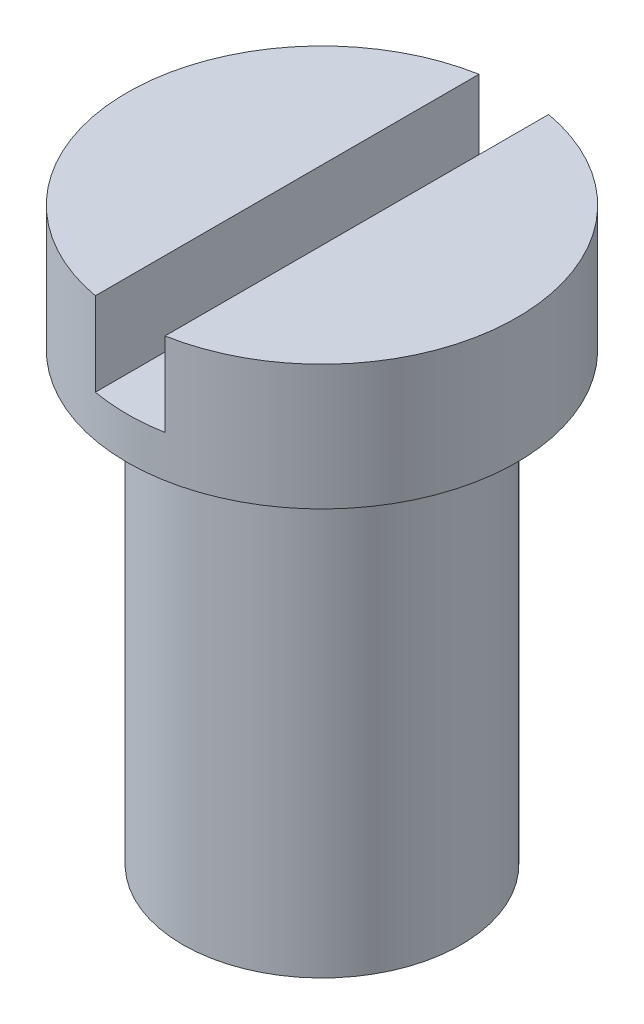
ISO-10303-21;
HEADER;
FILE_DESCRIPTION(('STEP AP214'),'2;1');
FILE_NAME('part.step','',(''),(''),'','','');
FILE_SCHEMA(('AUTOMOTIVE_DESIGN { 1 0 10303 214 1 1 1 1 }'));
ENDSEC;
DATA;
#1=APPLICATION_CONTEXT('core data for automotive mechanical design processes');
#2=APPLICATION_PROTOCOL_DEFINITION('international standard','automotive_design',2000,#1);
#3=PRODUCT_CONTEXT('',#1,'mechanical');
#4=PRODUCT('Part','Part','',(#3));
#5=PRODUCT_RELATED_PRODUCT_CATEGORY('part','',(#4));
#6=PRODUCT_DEFINITION_FORMATION('','',#4);
#7=PRODUCT_DEFINITION_CONTEXT('part definition',#1,'design');
#8=PRODUCT_DEFINITION('design','',#6,#7);
#9=PRODUCT_DEFINITION_SHAPE('','',#8);
#10=(LENGTH_UNIT() NAMED_UNIT(*) SI_UNIT(.MILLI.,.METRE.));
#11=(NAMED_UNIT(*) PLANE_ANGLE_UNIT() SI_UNIT($,.RADIAN.));
#12=(NAMED_UNIT(*) SI_UNIT($,.STERADIAN.) SOLID_ANGLE_UNIT());
#13=UNCERTAINTY_MEASURE_WITH_UNIT(LENGTH_MEASURE(1.E-05),#10,'distance_accuracy_value','');
#14=(GEOMETRIC_REPRESENTATION_CONTEXT(3) GLOBAL_UNCERTAINTY_ASSIGNED_CONTEXT((#13)) GLOBAL_UNIT_ASSIGNED_CONTEXT((#10,
#11,#12)) REPRESENTATION_CONTEXT('',''));
#15=CARTESIAN_POINT('',(0.,0.,0.));
#16=DIRECTION('',(0.,0.,1.));
#17=DIRECTION('',(1.,0.,0.));
#18=AXIS2_PLACEMENT_3D('',#15,#16,#17);
#19=CARTESIAN_POINT('',(15.546654773577,33.021554202414,1.140130435942));
#20=DIRECTION('',(0.,-1.,0.));
#21=DIRECTION('',(0.,0.,-1.));
#22=AXIS2_PLACEMENT_3D('',#19,#20,#21);
#23=PLANE('',#22);
#24=DIRECTION('',(0.,0.,1.));
#25=VECTOR('',#24,1.);
#26=CARTESIAN_POINT('',(15.546654773577,33.021554202414,1.140130435942));
#27=LINE('',#26,#25);
#28=CARTESIAN_POINT('',(15.546654773577,33.021554202414,-1.9173696954538));
#29=VERTEX_POINT('',#28);
#30=CARTESIAN_POINT('',(15.546654773577,33.021554202414,0.837625767337296));
#31=VERTEX_POINT('',#30);
#32=EDGE_CURVE('E72',#29,#31,#27,.T.);
#33=ORIENTED_EDGE('',*,*,#32,.T.);
#34=CARTESIAN_POINT('',(15.796654773577,33.021554202414,-0.539871964058));
#35=DIRECTION('',(0.,-1.,0.));
#36=DIRECTION('',(0.,0.,-1.));
#37=AXIS2_PLACEMENT_3D('',#34,#35,#36);
#38=CIRCLE('',#37,1.4);
#39=CARTESIAN_POINT('',(16.046654773577,33.021554202414,0.837625767337296));
#40=VERTEX_POINT('',#39);
#41=EDGE_CURVE('E20',#40,#31,#38,.T.);
#42=ORIENTED_EDGE('',*,*,#41,.F.);
#43=DIRECTION('',(0.,0.,-1.));
#44=VECTOR('',#43,1.);
#45=CARTESIAN_POINT('',(16.046654773577,33.021554202414,1.140130435942));
#46=LINE('',#45,#44);
#47=CARTESIAN_POINT('',(16.046654773577,33.021554202414,-1.9173696954538));
#48=VERTEX_POINT('',#47);
#49=EDGE_CURVE('E64',#40,#48,#46,.T.);
#50=ORIENTED_EDGE('',*,*,#49,.T.);
#51=CARTESIAN_POINT('',(15.796654773577,33.021554202414,-0.539871964058));
#52=DIRECTION('',(0.,-1.,0.));
#53=DIRECTION('',(0.,0.,-1.));
#54=AXIS2_PLACEMENT_3D('',#51,#52,#53);
#55=CIRCLE('',#54,1.4);
#56=EDGE_CURVE('E65',#29,#48,#55,.T.);
#57=ORIENTED_EDGE('',*,*,#56,.F.);
#58=EDGE_LOOP('',(#33,#42,#50,#57));
#59=FACE_BOUND('',#58,.T.);
#60=ADVANCED_FACE('F17',(#59),#23,.F.);
#61=CARTESIAN_POINT('',(16.046654773577,33.021554202414,1.140130435942));
#62=DIRECTION('',(1.,0.,0.));
#63=DIRECTION('',(0.,0.,-1.));
#64=AXIS2_PLACEMENT_3D('',#61,#62,#63);
#65=PLANE('',#64);
#66=ORIENTED_EDGE('',*,*,#49,.F.);
#67=DIRECTION('',(0.,1.,0.));
#68=VECTOR('',#67,1.);
#69=CARTESIAN_POINT('',(16.046654773577,33.021554202414,0.837625767337));
#70=LINE('',#69,#68);
#71=CARTESIAN_POINT('',(16.046654773577,33.621554202414,0.837625767337296));
#72=VERTEX_POINT('',#71);
#73=EDGE_CURVE('E53',#72,#40,#70,.F.);
#74=ORIENTED_EDGE('',*,*,#73,.F.);
#75=DIRECTION('',(0.,0.,-1.));
#76=VECTOR('',#75,1.);
#77=CARTESIAN_POINT('',(16.046654773577,33.621554202414,-0.539871964058));
#78=LINE('',#77,#76);
#79=CARTESIAN_POINT('',(16.046654773577,33.621554202414,-1.9173696954538));
#80=VERTEX_POINT('',#79);
#81=EDGE_CURVE('E92',#72,#80,#78,.T.);
#82=ORIENTED_EDGE('',*,*,#81,.T.);
#83=DIRECTION('',(0.,1.,0.));
#84=VECTOR('',#83,1.);
#85=CARTESIAN_POINT('',(16.046654773577,33.021554202414,-1.917369695454));
#86=LINE('',#85,#84);
#87=EDGE_CURVE('E74',#48,#80,#86,.T.);
#88=ORIENTED_EDGE('',*,*,#87,.F.);
#89=EDGE_LOOP('',(#66,#74,#82,#88));
#90=FACE_BOUND('',#89,.T.);
#91=ADVANCED_FACE('F73',(#90),#65,.F.);
#92=CARTESIAN_POINT('',(15.546654773577,33.621554202414,1.140130435942));
#93=DIRECTION('',(-1.,0.,0.));
#94=DIRECTION('',(0.,0.,1.));
#95=AXIS2_PLACEMENT_3D('',#92,#93,#94);
#96=PLANE('',#95);
#97=ORIENTED_EDGE('',*,*,#32,.F.);
#98=DIRECTION('',(0.,1.,0.));
#99=VECTOR('',#98,1.);
#100=CARTESIAN_POINT('',(15.546654773577,33.621554202414,-1.917369695454));
#101=LINE('',#100,#99);
#102=CARTESIAN_POINT('',(15.546654773577,33.621554202414,-1.9173696954538));
#103=VERTEX_POINT('',#102);
#104=EDGE_CURVE('E76',#103,#29,#101,.F.);
#105=ORIENTED_EDGE('',*,*,#104,.F.);
#106=DIRECTION('',(0.,0.,-1.));
#107=VECTOR('',#106,1.);
#108=CARTESIAN_POINT('',(15.546654773577,33.621554202414,-0.539871964058));
#109=LINE('',#108,#107);
#110=CARTESIAN_POINT('',(15.546654773577,33.621554202414,0.837625767337296));
#111=VERTEX_POINT('',#110);
#112=EDGE_CURVE('E87',#103,#111,#109,.F.);
#113=ORIENTED_EDGE('',*,*,#112,.T.);
#114=DIRECTION('',(0.,1.,0.));
#115=VECTOR('',#114,1.);
#116=CARTESIAN_POINT('',(15.546654773577,33.621554202414,0.837625767337));
#117=LINE('',#116,#115);
#118=EDGE_CURVE('E35',#31,#111,#117,.T.);
#119=ORIENTED_EDGE('',*,*,#118,.F.);
#120=EDGE_LOOP('',(#97,#105,#113,#119));
#121=FACE_BOUND('',#120,.T.);
#122=ADVANCED_FACE('F90',(#121),#96,.F.);
#123=CARTESIAN_POINT('',(15.196654773577,33.621554202414,-0.539871964058));
#124=DIRECTION('',(0.,-1.,0.));
#125=DIRECTION('',(0.,0.,-1.));
#126=AXIS2_PLACEMENT_3D('',#123,#124,#125);
#127=PLANE('',#126);
#128=CARTESIAN_POINT('',(15.796654773577,33.621554202414,-0.539871964058));
#129=DIRECTION('',(0.,-1.,0.));
#130=DIRECTION('',(0.,0.,-1.));
#131=AXIS2_PLACEMENT_3D('',#128,#129,#130);
#132=CIRCLE('',#131,1.4);
#133=EDGE_CURVE('E59',#80,#72,#132,.T.);
#134=ORIENTED_EDGE('',*,*,#133,.F.);
#135=ORIENTED_EDGE('',*,*,#81,.F.);
#136=EDGE_LOOP('',(#134,#135));
#137=FACE_BOUND('',#136,.T.);
#138=ADVANCED_FACE('F101',(#137),#127,.F.);
#139=CARTESIAN_POINT('',(15.196654773577,33.621554202414,-0.539871964058));
#140=DIRECTION('',(0.,-1.,0.));
#141=DIRECTION('',(0.,0.,-1.));
#142=AXIS2_PLACEMENT_3D('',#139,#140,#141);
#143=PLANE('',#142);
#144=CARTESIAN_POINT('',(15.796654773577,33.621554202414,-0.539871964058));
#145=DIRECTION('',(0.,-1.,0.));
#146=DIRECTION('',(0.,0.,-1.));
#147=AXIS2_PLACEMENT_3D('',#144,#145,#146);
#148=CIRCLE('',#147,1.4);
#149=EDGE_CURVE('E85',#111,#103,#148,.T.);
#150=ORIENTED_EDGE('',*,*,#149,.F.);
#151=ORIENTED_EDGE('',*,*,#112,.F.);
#152=EDGE_LOOP('',(#150,#151));
#153=FACE_BOUND('',#152,.T.);
#154=ADVANCED_FACE('F99',(#153),#143,.F.);
#155=CARTESIAN_POINT('',(15.796654773577,33.171554202414,-0.539871964058));
#156=DIRECTION('',(0.,-1.,0.));
#157=DIRECTION('',(0.,0.,-1.));
#158=AXIS2_PLACEMENT_3D('',#155,#156,#157);
#159=CYLINDRICAL_SURFACE('',#158,1.4);
#160=ORIENTED_EDGE('',*,*,#87,.T.);
#161=ORIENTED_EDGE('',*,*,#133,.T.);
#162=ORIENTED_EDGE('',*,*,#73,.T.);
#163=ORIENTED_EDGE('',*,*,#41,.T.);
#164=ORIENTED_EDGE('',*,*,#118,.T.);
#165=ORIENTED_EDGE('',*,*,#149,.T.);
#166=ORIENTED_EDGE('',*,*,#104,.T.);
#167=ORIENTED_EDGE('',*,*,#56,.T.);
#168=EDGE_LOOP('',(#160,#161,#162,#163,#164,#165,#166,#167));
#169=FACE_BOUND('',#168,.T.);
#170=CARTESIAN_POINT('',(15.796654773577,32.721554202414,-0.539871964058));
#171=DIRECTION('',(0.,-1.,0.));
#172=DIRECTION('',(0.,0.,-1.));
#173=AXIS2_PLACEMENT_3D('',#170,#171,#172);
#174=CIRCLE('',#173,1.4);
#175=CARTESIAN_POINT('',(15.796654773577,32.721554202414,-1.939871964058));
#176=VERTEX_POINT('',#175);
#177=EDGE_CURVE('E82',#176,#176,#174,.T.);
#178=ORIENTED_EDGE('',*,*,#177,.F.);
#179=EDGE_LOOP('',(#178));
#180=FACE_BOUND('',#179,.T.);
#181=ADVANCED_FACE('F56',(#169,#180),#159,.T.);
#182=CARTESIAN_POINT('',(14.696654773577,32.721554202414,-0.539871964058));
#183=DIRECTION('',(0.,-1.,0.));
#184=DIRECTION('',(0.,0.,-1.));
#185=AXIS2_PLACEMENT_3D('',#182,#183,#184);
#186=PLANE('',#185);
#187=ORIENTED_EDGE('',*,*,#177,.T.);
#188=EDGE_LOOP('',(#187));
#189=FACE_BOUND('',#188,.T.);
#190=CARTESIAN_POINT('',(15.796654773577,32.721554202414,-0.539871964058));
#191=DIRECTION('',(0.,-1.,0.));
#192=DIRECTION('',(0.,0.,-1.));
#193=AXIS2_PLACEMENT_3D('',#190,#191,#192);
#194=CIRCLE('',#193,1.);
#195=CARTESIAN_POINT('',(15.796654773577,32.721554202414,-1.539871964058));
#196=VERTEX_POINT('',#195);
#197=EDGE_CURVE('E26',#196,#196,#194,.T.);
#198=ORIENTED_EDGE('',*,*,#197,.F.);
#199=EDGE_LOOP('',(#198));
#200=FACE_BOUND('',#199,.T.);
#201=ADVANCED_FACE('F108',(#189,#200),#186,.T.);
#202=CARTESIAN_POINT('',(15.446654773577,29.521554202414,-0.539871964058));
#203=DIRECTION('',(0.,-1.,0.));
#204=DIRECTION('',(0.,0.,-1.));
#205=AXIS2_PLACEMENT_3D('',#202,#203,#204);
#206=PLANE('',#205);
#207=CARTESIAN_POINT('',(15.796654773577,29.521554202414,-0.539871964058));
#208=DIRECTION('',(0.,-1.,0.));
#209=DIRECTION('',(0.,0.,-1.));
#210=AXIS2_PLACEMENT_3D('',#207,#208,#209);
#211=CIRCLE('',#210,1.);
#212=CARTESIAN_POINT('',(15.796654773577,29.521554202414,-1.539871964058));
#213=VERTEX_POINT('',#212);
#214=EDGE_CURVE('E11',#213,#213,#211,.F.);
#215=ORIENTED_EDGE('',*,*,#214,.F.);
#216=EDGE_LOOP('',(#215));
#217=FACE_BOUND('',#216,.T.);
#218=ADVANCED_FACE('F114',(#217),#206,.T.);
#219=CARTESIAN_POINT('',(15.796654773577,31.458156742793,-0.539871964058));
#220=DIRECTION('',(0.,-1.,0.));
#221=DIRECTION('',(0.,0.,-1.));
#222=AXIS2_PLACEMENT_3D('',#219,#220,#221);
#223=CYLINDRICAL_SURFACE('',#222,1.);
#224=ORIENTED_EDGE('',*,*,#214,.T.);
#225=EDGE_LOOP('',(#224));
#226=FACE_BOUND('',#225,.T.);
#227=ORIENTED_EDGE('',*,*,#197,.T.);
#228=EDGE_LOOP('',(#227));
#229=FACE_BOUND('',#228,.T.);
#230=ADVANCED_FACE('F112',(#226,#229),#223,.T.);
#231=CLOSED_SHELL('',(#60,#91,#122,#138,#154,#181,#201,#218,#230));
#232=MANIFOLD_SOLID_BREP('B1',#231);
#233=ADVANCED_BREP_SHAPE_REPRESENTATION('',(#18,#232),#14);
#234=SHAPE_DEFINITION_REPRESENTATION(#9,#233);
ENDSEC;
END-ISO-10303-21;
